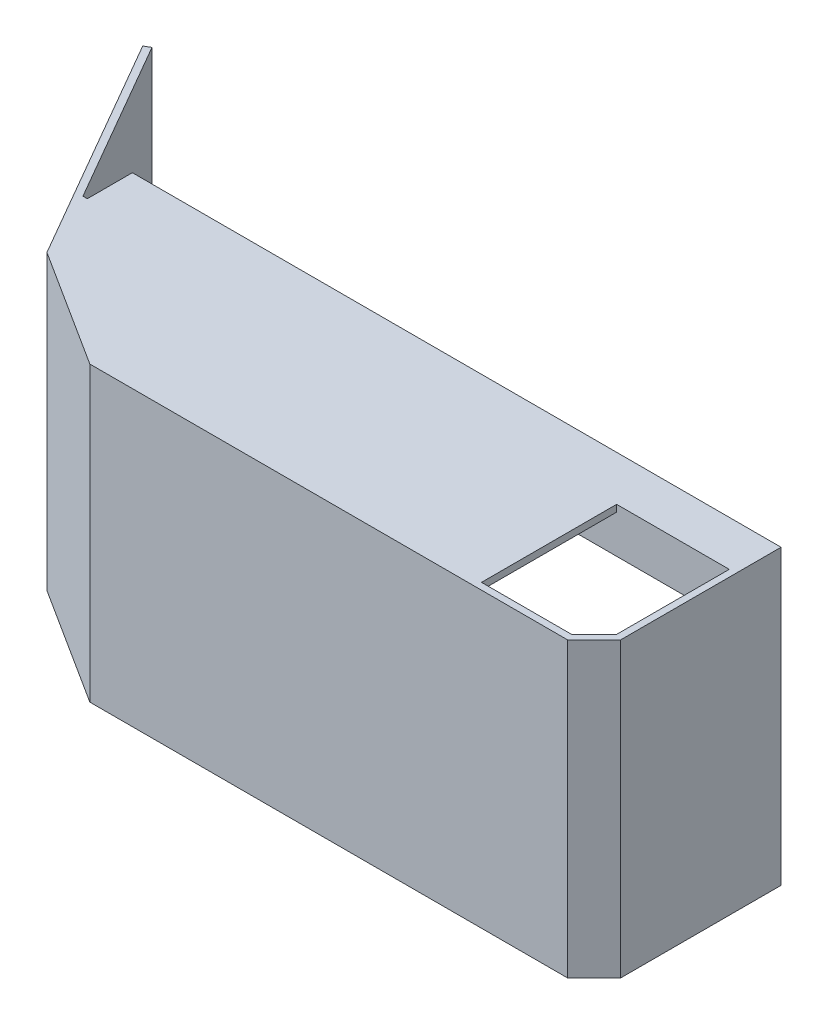
ISO-10303-21;
HEADER;
FILE_DESCRIPTION(('STEP AP214'),'2;1');
FILE_NAME('part.step','',(''),(''),'','','');
FILE_SCHEMA(('AUTOMOTIVE_DESIGN { 1 0 10303 214 1 1 1 1 }'));
ENDSEC;
DATA;
#1=APPLICATION_CONTEXT('core data for automotive mechanical design processes');
#2=APPLICATION_PROTOCOL_DEFINITION('international standard','automotive_design',2000,#1);
#3=PRODUCT_CONTEXT('',#1,'mechanical');
#4=PRODUCT('Part','Part','',(#3));
#5=PRODUCT_RELATED_PRODUCT_CATEGORY('part','',(#4));
#6=PRODUCT_DEFINITION_FORMATION('','',#4);
#7=PRODUCT_DEFINITION_CONTEXT('part definition',#1,'design');
#8=PRODUCT_DEFINITION('design','',#6,#7);
#9=PRODUCT_DEFINITION_SHAPE('','',#8);
#10=(LENGTH_UNIT() NAMED_UNIT(*) SI_UNIT(.MILLI.,.METRE.));
#11=(NAMED_UNIT(*) PLANE_ANGLE_UNIT() SI_UNIT($,.RADIAN.));
#12=(NAMED_UNIT(*) SI_UNIT($,.STERADIAN.) SOLID_ANGLE_UNIT());
#13=UNCERTAINTY_MEASURE_WITH_UNIT(LENGTH_MEASURE(1.E-05),#10,'distance_accuracy_value','');
#14=(GEOMETRIC_REPRESENTATION_CONTEXT(3) GLOBAL_UNCERTAINTY_ASSIGNED_CONTEXT((#13)) GLOBAL_UNIT_ASSIGNED_CONTEXT((#10,
#11,#12)) REPRESENTATION_CONTEXT('',''));
#15=CARTESIAN_POINT('',(0.,0.,0.));
#16=DIRECTION('',(0.,0.,1.));
#17=DIRECTION('',(1.,0.,0.));
#18=AXIS2_PLACEMENT_3D('',#15,#16,#17);
#19=CARTESIAN_POINT('',(0.,0.,20.));
#20=DIRECTION('',(0.,0.,-1.));
#21=DIRECTION('',(-1.,0.,0.));
#22=AXIS2_PLACEMENT_3D('',#19,#20,#21);
#23=PLANE('',#22);
#24=DIRECTION('',(0.,1.,0.));
#25=VECTOR('',#24,1.);
#26=CARTESIAN_POINT('',(122.5,-45.,20.));
#27=LINE('',#26,#25);
#28=CARTESIAN_POINT('',(122.5,-45.,20.));
#29=VERTEX_POINT('',#28);
#30=CARTESIAN_POINT('',(122.5,45.,20.));
#31=VERTEX_POINT('',#30);
#32=EDGE_CURVE('E394',#29,#31,#27,.T.);
#33=ORIENTED_EDGE('',*,*,#32,.F.);
#34=DIRECTION('',(1.,0.,0.));
#35=VECTOR('',#34,1.);
#36=CARTESIAN_POINT('',(-122.5,-45.,20.));
#37=LINE('',#36,#35);
#38=CARTESIAN_POINT('',(-122.5,-45.,20.));
#39=VERTEX_POINT('',#38);
#40=EDGE_CURVE('E405',#39,#29,#37,.T.);
#41=ORIENTED_EDGE('',*,*,#40,.F.);
#42=DIRECTION('',(0.,-1.,0.));
#43=VECTOR('',#42,1.);
#44=CARTESIAN_POINT('',(-122.5,-45.,20.));
#45=LINE('',#44,#43);
#46=CARTESIAN_POINT('',(-122.5,45.,20.));
#47=VERTEX_POINT('',#46);
#48=EDGE_CURVE('E401',#47,#39,#45,.T.);
#49=ORIENTED_EDGE('',*,*,#48,.F.);
#50=DIRECTION('',(-1.,0.,0.));
#51=VECTOR('',#50,1.);
#52=CARTESIAN_POINT('',(-122.5,45.,20.));
#53=LINE('',#52,#51);
#54=EDGE_CURVE('E397',#31,#47,#53,.T.);
#55=ORIENTED_EDGE('',*,*,#54,.F.);
#56=EDGE_LOOP('',(#33,#41,#49,#55));
#57=FACE_BOUND('',#56,.T.);
#58=DIRECTION('',(1.,0.,0.));
#59=VECTOR('',#58,1.);
#60=CARTESIAN_POINT('',(-188.916853121617,62.,20.));
#61=LINE('',#60,#59);
#62=CARTESIAN_POINT('',(-142.5,62.,20.));
#63=VERTEX_POINT('',#62);
#64=CARTESIAN_POINT('',(92.5,62.,20.));
#65=VERTEX_POINT('',#64);
#66=EDGE_CURVE('E519',#63,#65,#61,.T.);
#67=ORIENTED_EDGE('',*,*,#66,.F.);
#68=DIRECTION('',(0.,-1.,0.));
#69=VECTOR('',#68,1.);
#70=CARTESIAN_POINT('',(-142.5,-65.,20.));
#71=LINE('',#70,#69);
#72=CARTESIAN_POINT('',(-142.5,-62.,20.));
#73=VERTEX_POINT('',#72);
#74=EDGE_CURVE('E445',#63,#73,#71,.T.);
#75=ORIENTED_EDGE('',*,*,#74,.T.);
#76=DIRECTION('',(1.,0.,0.));
#77=VECTOR('',#76,1.);
#78=CARTESIAN_POINT('',(-188.916853121617,-62.,20.));
#79=LINE('',#78,#77);
#80=CARTESIAN_POINT('',(92.5,-62.,20.));
#81=VERTEX_POINT('',#80);
#82=EDGE_CURVE('E269',#73,#81,#79,.T.);
#83=ORIENTED_EDGE('',*,*,#82,.T.);
#84=DIRECTION('',(0.,-1.,0.));
#85=VECTOR('',#84,1.);
#86=CARTESIAN_POINT('',(92.5,-65.,20.));
#87=LINE('',#86,#85);
#88=CARTESIAN_POINT('',(92.5,-65.,20.));
#89=VERTEX_POINT('',#88);
#90=EDGE_CURVE('E248',#81,#89,#87,.T.);
#91=ORIENTED_EDGE('',*,*,#90,.T.);
#92=DIRECTION('',(1.,0.,0.));
#93=VECTOR('',#92,1.);
#94=CARTESIAN_POINT('',(-142.5,-65.,20.));
#95=LINE('',#94,#93);
#96=CARTESIAN_POINT('',(142.5,-65.,20.));
#97=VERTEX_POINT('',#96);
#98=EDGE_CURVE('E450',#89,#97,#95,.T.);
#99=ORIENTED_EDGE('',*,*,#98,.T.);
#100=DIRECTION('',(0.,1.,0.));
#101=VECTOR('',#100,1.);
#102=CARTESIAN_POINT('',(142.5,-65.,20.));
#103=LINE('',#102,#101);
#104=CARTESIAN_POINT('',(142.5,65.,20.));
#105=VERTEX_POINT('',#104);
#106=EDGE_CURVE('E437',#97,#105,#103,.T.);
#107=ORIENTED_EDGE('',*,*,#106,.T.);
#108=DIRECTION('',(-1.,0.,0.));
#109=VECTOR('',#108,1.);
#110=CARTESIAN_POINT('',(-142.5,65.,20.));
#111=LINE('',#110,#109);
#112=CARTESIAN_POINT('',(92.5,65.,20.));
#113=VERTEX_POINT('',#112);
#114=EDGE_CURVE('E441',#105,#113,#111,.T.);
#115=ORIENTED_EDGE('',*,*,#114,.T.);
#116=DIRECTION('',(0.,-1.,0.));
#117=VECTOR('',#116,1.);
#118=CARTESIAN_POINT('',(92.5,65.,20.));
#119=LINE('',#118,#117);
#120=EDGE_CURVE('E59',#113,#65,#119,.T.);
#121=ORIENTED_EDGE('',*,*,#120,.T.);
#122=EDGE_LOOP('',(#67,#75,#83,#91,#99,#107,#115,#121));
#123=FACE_BOUND('',#122,.T.);
#124=ADVANCED_FACE('F43',(#57,#123),#23,.F.);
#125=CARTESIAN_POINT('',(-186.316776910264,-65.,-52.5205715851498));
#126=DIRECTION('',(-0.866025403784439,0.,0.499999999999999));
#127=DIRECTION('',(0.499999999999999,0.,0.866025403784439));
#128=AXIS2_PLACEMENT_3D('',#125,#126,#127);
#129=PLANE('',#128);
#130=DIRECTION('',(0.499999999999999,0.,0.866025403784439));
#131=VECTOR('',#130,1.);
#132=CARTESIAN_POINT('',(-129.583705204715,62.,45.7439910783089));
#133=LINE('',#132,#131);
#134=CARTESIAN_POINT('',(-144.447005383792,62.,20.));
#135=VERTEX_POINT('',#134);
#136=CARTESIAN_POINT('',(-128.581749991301,62.,47.4794284148502));
#137=VERTEX_POINT('',#136);
#138=EDGE_CURVE('E527',#135,#137,#133,.T.);
#139=ORIENTED_EDGE('',*,*,#138,.T.);
#140=DIRECTION('',(0.,1.,0.));
#141=VECTOR('',#140,1.);
#142=CARTESIAN_POINT('',(-128.581749991301,-65.,47.4794284148502));
#143=LINE('',#142,#141);
#144=CARTESIAN_POINT('',(-128.581749991301,-62.,47.4794284148502));
#145=VERTEX_POINT('',#144);
#146=EDGE_CURVE('E377',#145,#137,#143,.T.);
#147=ORIENTED_EDGE('',*,*,#146,.F.);
#148=DIRECTION('',(-0.499999999999999,0.,-0.866025403784439));
#149=VECTOR('',#148,1.);
#150=CARTESIAN_POINT('',(-129.583705204715,-62.,45.7439910783089));
#151=LINE('',#150,#149);
#152=CARTESIAN_POINT('',(-144.447005383792,-62.,20.));
#153=VERTEX_POINT('',#152);
#154=EDGE_CURVE('E280',#145,#153,#151,.T.);
#155=ORIENTED_EDGE('',*,*,#154,.T.);
#156=DIRECTION('',(0.,-1.,0.));
#157=VECTOR('',#156,1.);
#158=CARTESIAN_POINT('',(-144.447005383792,-65.,20.));
#159=LINE('',#158,#157);
#160=CARTESIAN_POINT('',(-144.447005383792,-65.,20.));
#161=VERTEX_POINT('',#160);
#162=EDGE_CURVE('E235',#153,#161,#159,.T.);
#163=ORIENTED_EDGE('',*,*,#162,.T.);
#164=DIRECTION('',(0.499999999999999,0.,0.866025403784439));
#165=VECTOR('',#164,1.);
#166=CARTESIAN_POINT('',(-186.316776910264,-65.,-52.5205715851498));
#167=LINE('',#166,#165);
#168=CARTESIAN_POINT('',(-186.316776910264,-65.,-52.5205715851498));
#169=VERTEX_POINT('',#168);
#170=EDGE_CURVE('E304',#169,#161,#167,.T.);
#171=ORIENTED_EDGE('',*,*,#170,.F.);
#172=DIRECTION('',(0.,1.,0.));
#173=VECTOR('',#172,1.);
#174=CARTESIAN_POINT('',(-186.316776910264,-65.,-52.5205715851498));
#175=LINE('',#174,#173);
#176=CARTESIAN_POINT('',(-186.316776910264,65.,-52.5205715851498));
#177=VERTEX_POINT('',#176);
#178=EDGE_CURVE('E373',#169,#177,#175,.T.);
#179=ORIENTED_EDGE('',*,*,#178,.T.);
#180=DIRECTION('',(0.499999999999999,0.,0.866025403784439));
#181=VECTOR('',#180,1.);
#182=CARTESIAN_POINT('',(-186.316776910264,65.,-52.5205715851498));
#183=LINE('',#182,#181);
#184=CARTESIAN_POINT('',(-144.447005383792,65.,20.));
#185=VERTEX_POINT('',#184);
#186=EDGE_CURVE('E223',#177,#185,#183,.T.);
#187=ORIENTED_EDGE('',*,*,#186,.T.);
#188=DIRECTION('',(0.,-1.,0.));
#189=VECTOR('',#188,1.);
#190=CARTESIAN_POINT('',(-144.447005383792,65.,20.));
#191=LINE('',#190,#189);
#192=EDGE_CURVE('E67',#185,#135,#191,.T.);
#193=ORIENTED_EDGE('',*,*,#192,.T.);
#194=EDGE_LOOP('',(#139,#147,#155,#163,#171,#179,#187,#193));
#195=FACE_BOUND('',#194,.T.);
#196=ADVANCED_FACE('F499',(#195),#129,.F.);
#197=CARTESIAN_POINT('',(-128.581749991301,-65.,47.4794284148502));
#198=DIRECTION('',(-0.537040077774181,0.,0.84355672889516));
#199=DIRECTION('',(0.84355672889516,0.,0.537040077774181));
#200=AXIS2_PLACEMENT_3D('',#197,#198,#199);
#201=PLANE('',#200);
#202=DIRECTION('',(0.84355672889516,0.,0.537040077774181));
#203=VECTOR('',#202,1.);
#204=CARTESIAN_POINT('',(-156.782890650228,62.,29.5255170132701));
#205=LINE('',#204,#203);
#206=CARTESIAN_POINT('',(-77.5,62.,80.));
#207=VERTEX_POINT('',#206);
#208=EDGE_CURVE('E524',#137,#207,#205,.T.);
#209=ORIENTED_EDGE('',*,*,#208,.T.);
#210=DIRECTION('',(0.,1.,0.));
#211=VECTOR('',#210,1.);
#212=CARTESIAN_POINT('',(-77.5,-65.,80.));
#213=LINE('',#212,#211);
#214=CARTESIAN_POINT('',(-77.5,-62.,80.));
#215=VERTEX_POINT('',#214);
#216=EDGE_CURVE('E381',#215,#207,#213,.T.);
#217=ORIENTED_EDGE('',*,*,#216,.F.);
#218=DIRECTION('',(-0.84355672889516,0.,-0.537040077774181));
#219=VECTOR('',#218,1.);
#220=CARTESIAN_POINT('',(-156.782890650228,-62.,29.5255170132701));
#221=LINE('',#220,#219);
#222=EDGE_CURVE('E270',#215,#145,#221,.T.);
#223=ORIENTED_EDGE('',*,*,#222,.T.);
#224=ORIENTED_EDGE('',*,*,#146,.T.);
#225=EDGE_LOOP('',(#209,#217,#223,#224));
#226=FACE_BOUND('',#225,.T.);
#227=ADVANCED_FACE('F555',(#226),#201,.F.);
#228=CARTESIAN_POINT('',(-77.5,-65.,80.));
#229=DIRECTION('',(0.,0.,1.));
#230=DIRECTION('',(1.,0.,0.));
#231=AXIS2_PLACEMENT_3D('',#228,#229,#230);
#232=PLANE('',#231);
#233=DIRECTION('',(1.,0.,0.));
#234=VECTOR('',#233,1.);
#235=CARTESIAN_POINT('',(-188.916853121617,62.,80.));
#236=LINE('',#235,#234);
#237=CARTESIAN_POINT('',(92.5,62.,80.));
#238=VERTEX_POINT('',#237);
#239=EDGE_CURVE('E230',#207,#238,#236,.T.);
#240=ORIENTED_EDGE('',*,*,#239,.T.);
#241=DIRECTION('',(0.,1.,0.));
#242=VECTOR('',#241,1.);
#243=CARTESIAN_POINT('',(92.5,65.,80.));
#244=LINE('',#243,#242);
#245=CARTESIAN_POINT('',(92.5,65.,80.));
#246=VERTEX_POINT('',#245);
#247=EDGE_CURVE('E226',#238,#246,#244,.T.);
#248=ORIENTED_EDGE('',*,*,#247,.T.);
#249=DIRECTION('',(1.,0.,0.));
#250=VECTOR('',#249,1.);
#251=CARTESIAN_POINT('',(-77.5,65.,80.));
#252=LINE('',#251,#250);
#253=CARTESIAN_POINT('',(132.5,65.,80.));
#254=VERTEX_POINT('',#253);
#255=EDGE_CURVE('E212',#246,#254,#252,.T.);
#256=ORIENTED_EDGE('',*,*,#255,.T.);
#257=DIRECTION('',(0.,1.,0.));
#258=VECTOR('',#257,1.);
#259=CARTESIAN_POINT('',(132.5,-65.,80.));
#260=LINE('',#259,#258);
#261=CARTESIAN_POINT('',(132.5,-65.,80.));
#262=VERTEX_POINT('',#261);
#263=EDGE_CURVE('E384',#262,#254,#260,.T.);
#264=ORIENTED_EDGE('',*,*,#263,.F.);
#265=DIRECTION('',(1.,0.,0.));
#266=VECTOR('',#265,1.);
#267=CARTESIAN_POINT('',(-77.5,-65.,80.));
#268=LINE('',#267,#266);
#269=CARTESIAN_POINT('',(92.5,-65.,80.));
#270=VERTEX_POINT('',#269);
#271=EDGE_CURVE('E301',#270,#262,#268,.T.);
#272=ORIENTED_EDGE('',*,*,#271,.F.);
#273=DIRECTION('',(0.,1.,0.));
#274=VECTOR('',#273,1.);
#275=CARTESIAN_POINT('',(92.5,-65.,80.));
#276=LINE('',#275,#274);
#277=CARTESIAN_POINT('',(92.5,-62.,80.));
#278=VERTEX_POINT('',#277);
#279=EDGE_CURVE('E258',#270,#278,#276,.T.);
#280=ORIENTED_EDGE('',*,*,#279,.T.);
#281=DIRECTION('',(1.,0.,0.));
#282=VECTOR('',#281,1.);
#283=CARTESIAN_POINT('',(-188.916853121617,-62.,80.));
#284=LINE('',#283,#282);
#285=EDGE_CURVE('E265',#215,#278,#284,.T.);
#286=ORIENTED_EDGE('',*,*,#285,.F.);
#287=ORIENTED_EDGE('',*,*,#216,.T.);
#288=EDGE_LOOP('',(#240,#248,#256,#264,#272,#280,#286,#287));
#289=FACE_BOUND('',#288,.T.);
#290=ADVANCED_FACE('F227',(#289),#232,.F.);
#291=CARTESIAN_POINT('',(0.,0.,0.));
#292=DIRECTION('',(0.,0.,-1.));
#293=DIRECTION('',(-1.,0.,0.));
#294=AXIS2_PLACEMENT_3D('',#291,#292,#293);
#295=PLANE('',#294);
#296=DIRECTION('',(-1.,0.,0.));
#297=VECTOR('',#296,1.);
#298=CARTESIAN_POINT('',(-142.5,65.,0.));
#299=LINE('',#298,#297);
#300=CARTESIAN_POINT('',(145.5,65.,0.));
#301=VERTEX_POINT('',#300);
#302=CARTESIAN_POINT('',(-142.5,65.,0.));
#303=VERTEX_POINT('',#302);
#304=EDGE_CURVE('E436',#301,#303,#299,.T.);
#305=ORIENTED_EDGE('',*,*,#304,.F.);
#306=DIRECTION('',(0.,1.,0.));
#307=VECTOR('',#306,1.);
#308=CARTESIAN_POINT('',(145.5,-65.,0.));
#309=LINE('',#308,#307);
#310=CARTESIAN_POINT('',(145.5,-65.,0.));
#311=VERTEX_POINT('',#310);
#312=EDGE_CURVE('E327',#311,#301,#309,.T.);
#313=ORIENTED_EDGE('',*,*,#312,.F.);
#314=DIRECTION('',(1.,0.,0.));
#315=VECTOR('',#314,1.);
#316=CARTESIAN_POINT('',(-142.5,-65.,0.));
#317=LINE('',#316,#315);
#318=CARTESIAN_POINT('',(-142.5,-65.,0.));
#319=VERTEX_POINT('',#318);
#320=EDGE_CURVE('E442',#319,#311,#317,.T.);
#321=ORIENTED_EDGE('',*,*,#320,.F.);
#322=DIRECTION('',(0.,-1.,0.));
#323=VECTOR('',#322,1.);
#324=CARTESIAN_POINT('',(-142.5,-65.,0.));
#325=LINE('',#324,#323);
#326=EDGE_CURVE('E455',#303,#319,#325,.T.);
#327=ORIENTED_EDGE('',*,*,#326,.F.);
#328=EDGE_LOOP('',(#305,#313,#321,#327));
#329=FACE_BOUND('',#328,.T.);
#330=DIRECTION('',(1.,0.,0.));
#331=VECTOR('',#330,1.);
#332=CARTESIAN_POINT('',(-122.5,-45.,0.));
#333=LINE('',#332,#331);
#334=CARTESIAN_POINT('',(-122.5,-45.,0.));
#335=VERTEX_POINT('',#334);
#336=CARTESIAN_POINT('',(122.5,-45.,0.));
#337=VERTEX_POINT('',#336);
#338=EDGE_CURVE('E398',#335,#337,#333,.T.);
#339=ORIENTED_EDGE('',*,*,#338,.T.);
#340=DIRECTION('',(0.,1.,0.));
#341=VECTOR('',#340,1.);
#342=CARTESIAN_POINT('',(122.5,-45.,0.));
#343=LINE('',#342,#341);
#344=CARTESIAN_POINT('',(122.5,45.,0.));
#345=VERTEX_POINT('',#344);
#346=EDGE_CURVE('E360',#337,#345,#343,.T.);
#347=ORIENTED_EDGE('',*,*,#346,.T.);
#348=DIRECTION('',(-1.,0.,0.));
#349=VECTOR('',#348,1.);
#350=CARTESIAN_POINT('',(-122.5,45.,0.));
#351=LINE('',#350,#349);
#352=CARTESIAN_POINT('',(-122.5,45.,0.));
#353=VERTEX_POINT('',#352);
#354=EDGE_CURVE('E412',#345,#353,#351,.T.);
#355=ORIENTED_EDGE('',*,*,#354,.T.);
#356=DIRECTION('',(0.,-1.,0.));
#357=VECTOR('',#356,1.);
#358=CARTESIAN_POINT('',(-122.5,-45.,0.));
#359=LINE('',#358,#357);
#360=EDGE_CURVE('E416',#353,#335,#359,.T.);
#361=ORIENTED_EDGE('',*,*,#360,.T.);
#362=EDGE_LOOP('',(#339,#347,#355,#361));
#363=FACE_BOUND('',#362,.T.);
#364=ADVANCED_FACE('F471',(#329,#363),#295,.T.);
#365=CARTESIAN_POINT('',(-142.5,65.,20.));
#366=DIRECTION('',(0.,-1.,0.));
#367=DIRECTION('',(0.,0.,-1.));
#368=AXIS2_PLACEMENT_3D('',#365,#366,#367);
#369=PLANE('',#368);
#370=DIRECTION('',(0.,0.,-1.));
#371=VECTOR('',#370,1.);
#372=CARTESIAN_POINT('',(92.5,65.,80.));
#373=LINE('',#372,#371);
#374=EDGE_CURVE('E216',#246,#113,#373,.T.);
#375=ORIENTED_EDGE('',*,*,#374,.T.);
#376=ORIENTED_EDGE('',*,*,#114,.F.);
#377=DIRECTION('',(0.,0.,-1.));
#378=VECTOR('',#377,1.);
#379=CARTESIAN_POINT('',(142.5,65.,70.));
#380=LINE('',#379,#378);
#381=CARTESIAN_POINT('',(142.5,65.,70.));
#382=VERTEX_POINT('',#381);
#383=EDGE_CURVE('E331',#382,#105,#380,.T.);
#384=ORIENTED_EDGE('',*,*,#383,.F.);
#385=DIRECTION('',(0.707106781186548,0.,-0.707106781186547));
#386=VECTOR('',#385,1.);
#387=CARTESIAN_POINT('',(132.5,65.,80.));
#388=LINE('',#387,#386);
#389=EDGE_CURVE('E218',#254,#382,#388,.T.);
#390=ORIENTED_EDGE('',*,*,#389,.F.);
#391=ORIENTED_EDGE('',*,*,#255,.F.);
#392=EDGE_LOOP('',(#375,#376,#384,#390,#391));
#393=FACE_BOUND('',#392,.T.);
#394=ORIENTED_EDGE('',*,*,#304,.T.);
#395=DIRECTION('',(0.,0.,-1.));
#396=VECTOR('',#395,1.);
#397=CARTESIAN_POINT('',(-142.5,65.,20.));
#398=LINE('',#397,#396);
#399=CARTESIAN_POINT('',(-142.5,65.,20.));
#400=VERTEX_POINT('',#399);
#401=EDGE_CURVE('E11',#400,#303,#398,.T.);
#402=ORIENTED_EDGE('',*,*,#401,.F.);
#403=DIRECTION('',(1.,0.,0.));
#404=VECTOR('',#403,1.);
#405=CARTESIAN_POINT('',(-188.916853121617,65.,20.));
#406=LINE('',#405,#404);
#407=EDGE_CURVE('E520',#185,#400,#406,.T.);
#408=ORIENTED_EDGE('',*,*,#407,.F.);
#409=ORIENTED_EDGE('',*,*,#186,.F.);
#410=DIRECTION('',(0.866025403784441,0.,-0.499999999999997));
#411=VECTOR('',#410,1.);
#412=CARTESIAN_POINT('',(-188.914853121617,65.,-51.0205715851498));
#413=LINE('',#412,#411);
#414=CARTESIAN_POINT('',(-188.914853121617,65.,-51.0205715851498));
#415=VERTEX_POINT('',#414);
#416=EDGE_CURVE('E339',#415,#177,#413,.T.);
#417=ORIENTED_EDGE('',*,*,#416,.F.);
#418=DIRECTION('',(0.499999999999999,0.,0.866025403784439));
#419=VECTOR('',#418,1.);
#420=CARTESIAN_POINT('',(-188.914853121617,65.,-51.0205715851498));
#421=LINE('',#420,#419);
#422=CARTESIAN_POINT('',(-130.812533941448,65.,49.6155972724871));
#423=VERTEX_POINT('',#422);
#424=EDGE_CURVE('E342',#415,#423,#421,.T.);
#425=ORIENTED_EDGE('',*,*,#424,.T.);
#426=DIRECTION('',(0.84355672889516,0.,0.537040077774181));
#427=VECTOR('',#426,1.);
#428=CARTESIAN_POINT('',(-130.192870224624,65.,50.0100986015357));
#429=LINE('',#428,#427);
#430=CARTESIAN_POINT('',(-78.3739195317781,65.,83.));
#431=VERTEX_POINT('',#430);
#432=EDGE_CURVE('E346',#423,#431,#429,.T.);
#433=ORIENTED_EDGE('',*,*,#432,.T.);
#434=DIRECTION('',(1.,0.,0.));
#435=VECTOR('',#434,1.);
#436=CARTESIAN_POINT('',(-77.5,65.,83.));
#437=LINE('',#436,#435);
#438=CARTESIAN_POINT('',(133.742640687119,65.,83.));
#439=VERTEX_POINT('',#438);
#440=EDGE_CURVE('E350',#431,#439,#437,.T.);
#441=ORIENTED_EDGE('',*,*,#440,.T.);
#442=DIRECTION('',(0.707106781186548,0.,-0.707106781186547));
#443=VECTOR('',#442,1.);
#444=CARTESIAN_POINT('',(134.62132034356,65.,82.1213203435596));
#445=LINE('',#444,#443);
#446=CARTESIAN_POINT('',(145.5,65.,71.2426406871193));
#447=VERTEX_POINT('',#446);
#448=EDGE_CURVE('E294',#439,#447,#445,.T.);
#449=ORIENTED_EDGE('',*,*,#448,.T.);
#450=DIRECTION('',(0.,0.,-1.));
#451=VECTOR('',#450,1.);
#452=CARTESIAN_POINT('',(145.5,65.,70.));
#453=LINE('',#452,#451);
#454=EDGE_CURVE('E288',#447,#301,#453,.T.);
#455=ORIENTED_EDGE('',*,*,#454,.T.);
#456=EDGE_LOOP('',(#394,#402,#408,#409,#417,#425,#433,#441,#449,#455));
#457=FACE_BOUND('',#456,.T.);
#458=ADVANCED_FACE('F45',(#393,#457),#369,.F.);
#459=CARTESIAN_POINT('',(-142.5,-65.,20.));
#460=DIRECTION('',(1.,0.,0.));
#461=DIRECTION('',(0.,0.,-1.));
#462=AXIS2_PLACEMENT_3D('',#459,#460,#461);
#463=PLANE('',#462);
#464=ORIENTED_EDGE('',*,*,#326,.T.);
#465=DIRECTION('',(0.,0.,-1.));
#466=VECTOR('',#465,1.);
#467=CARTESIAN_POINT('',(-142.5,-65.,20.));
#468=LINE('',#467,#466);
#469=CARTESIAN_POINT('',(-142.5,-65.,20.));
#470=VERTEX_POINT('',#469);
#471=EDGE_CURVE('E52',#470,#319,#468,.T.);
#472=ORIENTED_EDGE('',*,*,#471,.F.);
#473=DIRECTION('',(0.,-1.,0.));
#474=VECTOR('',#473,1.);
#475=CARTESIAN_POINT('',(-142.5,-65.,20.));
#476=LINE('',#475,#474);
#477=EDGE_CURVE('E261',#73,#470,#476,.T.);
#478=ORIENTED_EDGE('',*,*,#477,.F.);
#479=ORIENTED_EDGE('',*,*,#74,.F.);
#480=EDGE_CURVE('E446',#400,#63,#71,.T.);
#481=ORIENTED_EDGE('',*,*,#480,.F.);
#482=ORIENTED_EDGE('',*,*,#401,.T.);
#483=EDGE_LOOP('',(#464,#472,#478,#479,#481,#482));
#484=FACE_BOUND('',#483,.T.);
#485=ADVANCED_FACE('F538',(#484),#463,.F.);
#486=CARTESIAN_POINT('',(-142.5,-65.,20.));
#487=DIRECTION('',(0.,1.,0.));
#488=DIRECTION('',(0.,0.,1.));
#489=AXIS2_PLACEMENT_3D('',#486,#487,#488);
#490=PLANE('',#489);
#491=ORIENTED_EDGE('',*,*,#98,.F.);
#492=DIRECTION('',(0.,0.,1.));
#493=VECTOR('',#492,1.);
#494=CARTESIAN_POINT('',(92.5,-65.,80.));
#495=LINE('',#494,#493);
#496=EDGE_CURVE('E253',#89,#270,#495,.T.);
#497=ORIENTED_EDGE('',*,*,#496,.T.);
#498=ORIENTED_EDGE('',*,*,#271,.T.);
#499=DIRECTION('',(0.707106781186548,0.,-0.707106781186547));
#500=VECTOR('',#499,1.);
#501=CARTESIAN_POINT('',(132.5,-65.,80.));
#502=LINE('',#501,#500);
#503=CARTESIAN_POINT('',(142.5,-65.,70.));
#504=VERTEX_POINT('',#503);
#505=EDGE_CURVE('E298',#262,#504,#502,.T.);
#506=ORIENTED_EDGE('',*,*,#505,.T.);
#507=DIRECTION('',(0.,0.,-1.));
#508=VECTOR('',#507,1.);
#509=CARTESIAN_POINT('',(142.5,-65.,70.));
#510=LINE('',#509,#508);
#511=EDGE_CURVE('E293',#504,#97,#510,.T.);
#512=ORIENTED_EDGE('',*,*,#511,.T.);
#513=EDGE_LOOP('',(#491,#497,#498,#506,#512));
#514=FACE_BOUND('',#513,.T.);
#515=ORIENTED_EDGE('',*,*,#320,.T.);
#516=DIRECTION('',(0.,0.,-1.));
#517=VECTOR('',#516,1.);
#518=CARTESIAN_POINT('',(145.5,-65.,70.));
#519=LINE('',#518,#517);
#520=CARTESIAN_POINT('',(145.5,-65.,71.2426406871193));
#521=VERTEX_POINT('',#520);
#522=EDGE_CURVE('E289',#521,#311,#519,.T.);
#523=ORIENTED_EDGE('',*,*,#522,.F.);
#524=DIRECTION('',(0.707106781186548,0.,-0.707106781186547));
#525=VECTOR('',#524,1.);
#526=CARTESIAN_POINT('',(134.62132034356,-65.,82.1213203435596));
#527=LINE('',#526,#525);
#528=CARTESIAN_POINT('',(133.742640687119,-65.,83.));
#529=VERTEX_POINT('',#528);
#530=EDGE_CURVE('E323',#529,#521,#527,.T.);
#531=ORIENTED_EDGE('',*,*,#530,.F.);
#532=DIRECTION('',(1.,0.,0.));
#533=VECTOR('',#532,1.);
#534=CARTESIAN_POINT('',(-77.5,-65.,83.));
#535=LINE('',#534,#533);
#536=CARTESIAN_POINT('',(-78.3739195317781,-65.,83.));
#537=VERTEX_POINT('',#536);
#538=EDGE_CURVE('E319',#537,#529,#535,.T.);
#539=ORIENTED_EDGE('',*,*,#538,.F.);
#540=DIRECTION('',(0.84355672889516,0.,0.537040077774181));
#541=VECTOR('',#540,1.);
#542=CARTESIAN_POINT('',(-130.192870224624,-65.,50.0100986015357));
#543=LINE('',#542,#541);
#544=CARTESIAN_POINT('',(-130.812533941448,-65.,49.6155972724871));
#545=VERTEX_POINT('',#544);
#546=EDGE_CURVE('E315',#545,#537,#543,.T.);
#547=ORIENTED_EDGE('',*,*,#546,.F.);
#548=DIRECTION('',(0.499999999999999,0.,0.866025403784439));
#549=VECTOR('',#548,1.);
#550=CARTESIAN_POINT('',(-188.914853121617,-65.,-51.0205715851498));
#551=LINE('',#550,#549);
#552=CARTESIAN_POINT('',(-188.914853121617,-65.,-51.0205715851498));
#553=VERTEX_POINT('',#552);
#554=EDGE_CURVE('E311',#553,#545,#551,.T.);
#555=ORIENTED_EDGE('',*,*,#554,.F.);
#556=DIRECTION('',(0.866025403784441,0.,-0.499999999999997));
#557=VECTOR('',#556,1.);
#558=CARTESIAN_POINT('',(-188.914853121617,-65.,-51.0205715851498));
#559=LINE('',#558,#557);
#560=EDGE_CURVE('E308',#553,#169,#559,.T.);
#561=ORIENTED_EDGE('',*,*,#560,.T.);
#562=ORIENTED_EDGE('',*,*,#170,.T.);
#563=DIRECTION('',(1.,0.,0.));
#564=VECTOR('',#563,1.);
#565=CARTESIAN_POINT('',(-188.916853121617,-65.,20.));
#566=LINE('',#565,#564);
#567=EDGE_CURVE('E257',#161,#470,#566,.T.);
#568=ORIENTED_EDGE('',*,*,#567,.T.);
#569=ORIENTED_EDGE('',*,*,#471,.T.);
#570=EDGE_LOOP('',(#515,#523,#531,#539,#547,#555,#561,#562,#568,#569));
#571=FACE_BOUND('',#570,.T.);
#572=ADVANCED_FACE('F463',(#514,#571),#490,.F.);
#573=CARTESIAN_POINT('',(122.5,-45.,20.));
#574=DIRECTION('',(-1.,0.,0.));
#575=DIRECTION('',(0.,0.,1.));
#576=AXIS2_PLACEMENT_3D('',#573,#574,#575);
#577=PLANE('',#576);
#578=ORIENTED_EDGE('',*,*,#346,.F.);
#579=DIRECTION('',(0.,0.,-1.));
#580=VECTOR('',#579,1.);
#581=CARTESIAN_POINT('',(122.5,-45.,20.));
#582=LINE('',#581,#580);
#583=EDGE_CURVE('E408',#29,#337,#582,.T.);
#584=ORIENTED_EDGE('',*,*,#583,.F.);
#585=ORIENTED_EDGE('',*,*,#32,.T.);
#586=DIRECTION('',(0.,0.,-1.));
#587=VECTOR('',#586,1.);
#588=CARTESIAN_POINT('',(122.5,45.,20.));
#589=LINE('',#588,#587);
#590=EDGE_CURVE('E432',#31,#345,#589,.T.);
#591=ORIENTED_EDGE('',*,*,#590,.T.);
#592=EDGE_LOOP('',(#578,#584,#585,#591));
#593=FACE_BOUND('',#592,.T.);
#594=ADVANCED_FACE('F559',(#593),#577,.T.);
#595=CARTESIAN_POINT('',(-122.5,45.,20.));
#596=DIRECTION('',(0.,-1.,0.));
#597=DIRECTION('',(0.,0.,-1.));
#598=AXIS2_PLACEMENT_3D('',#595,#596,#597);
#599=PLANE('',#598);
#600=ORIENTED_EDGE('',*,*,#354,.F.);
#601=ORIENTED_EDGE('',*,*,#590,.F.);
#602=ORIENTED_EDGE('',*,*,#54,.T.);
#603=DIRECTION('',(0.,0.,-1.));
#604=VECTOR('',#603,1.);
#605=CARTESIAN_POINT('',(-122.5,45.,20.));
#606=LINE('',#605,#604);
#607=EDGE_CURVE('E429',#47,#353,#606,.T.);
#608=ORIENTED_EDGE('',*,*,#607,.T.);
#609=EDGE_LOOP('',(#600,#601,#602,#608));
#610=FACE_BOUND('',#609,.T.);
#611=ADVANCED_FACE('F567',(#610),#599,.T.);
#612=CARTESIAN_POINT('',(-122.5,-45.,20.));
#613=DIRECTION('',(1.,0.,0.));
#614=DIRECTION('',(0.,0.,-1.));
#615=AXIS2_PLACEMENT_3D('',#612,#613,#614);
#616=PLANE('',#615);
#617=ORIENTED_EDGE('',*,*,#360,.F.);
#618=ORIENTED_EDGE('',*,*,#607,.F.);
#619=ORIENTED_EDGE('',*,*,#48,.T.);
#620=DIRECTION('',(0.,0.,-1.));
#621=VECTOR('',#620,1.);
#622=CARTESIAN_POINT('',(-122.5,-45.,20.));
#623=LINE('',#622,#621);
#624=EDGE_CURVE('E426',#39,#335,#623,.T.);
#625=ORIENTED_EDGE('',*,*,#624,.T.);
#626=EDGE_LOOP('',(#617,#618,#619,#625));
#627=FACE_BOUND('',#626,.T.);
#628=ADVANCED_FACE('F598',(#627),#616,.T.);
#629=CARTESIAN_POINT('',(-122.5,-45.,20.));
#630=DIRECTION('',(0.,1.,0.));
#631=DIRECTION('',(0.,0.,1.));
#632=AXIS2_PLACEMENT_3D('',#629,#630,#631);
#633=PLANE('',#632);
#634=ORIENTED_EDGE('',*,*,#338,.F.);
#635=ORIENTED_EDGE('',*,*,#624,.F.);
#636=ORIENTED_EDGE('',*,*,#40,.T.);
#637=ORIENTED_EDGE('',*,*,#583,.T.);
#638=EDGE_LOOP('',(#634,#635,#636,#637));
#639=FACE_BOUND('',#638,.T.);
#640=ADVANCED_FACE('F592',(#639),#633,.T.);
#641=CARTESIAN_POINT('',(142.5,-65.,70.));
#642=DIRECTION('',(1.,0.,0.));
#643=DIRECTION('',(0.,0.,-1.));
#644=AXIS2_PLACEMENT_3D('',#641,#642,#643);
#645=PLANE('',#644);
#646=ORIENTED_EDGE('',*,*,#383,.T.);
#647=ORIENTED_EDGE('',*,*,#106,.F.);
#648=ORIENTED_EDGE('',*,*,#511,.F.);
#649=DIRECTION('',(0.,1.,0.));
#650=VECTOR('',#649,1.);
#651=CARTESIAN_POINT('',(142.5,-65.,70.));
#652=LINE('',#651,#650);
#653=EDGE_CURVE('E387',#504,#382,#652,.T.);
#654=ORIENTED_EDGE('',*,*,#653,.T.);
#655=EDGE_LOOP('',(#646,#647,#648,#654));
#656=FACE_BOUND('',#655,.T.);
#657=ADVANCED_FACE('F590',(#656),#645,.F.);
#658=CARTESIAN_POINT('',(145.5,-65.,70.));
#659=DIRECTION('',(1.,0.,0.));
#660=DIRECTION('',(0.,0.,-1.));
#661=AXIS2_PLACEMENT_3D('',#658,#659,#660);
#662=PLANE('',#661);
#663=ORIENTED_EDGE('',*,*,#454,.F.);
#664=DIRECTION('',(0.,1.,0.));
#665=VECTOR('',#664,1.);
#666=CARTESIAN_POINT('',(145.5,-65.,71.2426406871193));
#667=LINE('',#666,#665);
#668=EDGE_CURVE('E357',#521,#447,#667,.T.);
#669=ORIENTED_EDGE('',*,*,#668,.F.);
#670=ORIENTED_EDGE('',*,*,#522,.T.);
#671=ORIENTED_EDGE('',*,*,#312,.T.);
#672=EDGE_LOOP('',(#663,#669,#670,#671));
#673=FACE_BOUND('',#672,.T.);
#674=ADVANCED_FACE('F475',(#673),#662,.T.);
#675=CARTESIAN_POINT('',(134.62132034356,-65.,82.1213203435596));
#676=DIRECTION('',(0.707106781186547,0.,0.707106781186548));
#677=DIRECTION('',(0.707106781186548,0.,-0.707106781186547));
#678=AXIS2_PLACEMENT_3D('',#675,#676,#677);
#679=PLANE('',#678);
#680=ORIENTED_EDGE('',*,*,#448,.F.);
#681=DIRECTION('',(0.,1.,0.));
#682=VECTOR('',#681,1.);
#683=CARTESIAN_POINT('',(133.742640687119,-65.,83.));
#684=LINE('',#683,#682);
#685=EDGE_CURVE('E361',#529,#439,#684,.T.);
#686=ORIENTED_EDGE('',*,*,#685,.F.);
#687=ORIENTED_EDGE('',*,*,#530,.T.);
#688=ORIENTED_EDGE('',*,*,#668,.T.);
#689=EDGE_LOOP('',(#680,#686,#687,#688));
#690=FACE_BOUND('',#689,.T.);
#691=ADVANCED_FACE('F480',(#690),#679,.T.);
#692=CARTESIAN_POINT('',(-77.5,-65.,83.));
#693=DIRECTION('',(0.,0.,1.));
#694=DIRECTION('',(1.,0.,0.));
#695=AXIS2_PLACEMENT_3D('',#692,#693,#694);
#696=PLANE('',#695);
#697=ORIENTED_EDGE('',*,*,#440,.F.);
#698=DIRECTION('',(0.,1.,0.));
#699=VECTOR('',#698,1.);
#700=CARTESIAN_POINT('',(-78.3739195317781,-65.,83.));
#701=LINE('',#700,#699);
#702=EDGE_CURVE('E364',#537,#431,#701,.T.);
#703=ORIENTED_EDGE('',*,*,#702,.F.);
#704=ORIENTED_EDGE('',*,*,#538,.T.);
#705=ORIENTED_EDGE('',*,*,#685,.T.);
#706=EDGE_LOOP('',(#697,#703,#704,#705));
#707=FACE_BOUND('',#706,.T.);
#708=ADVANCED_FACE('F483',(#707),#696,.T.);
#709=CARTESIAN_POINT('',(-130.192870224624,-65.,50.0100986015357));
#710=DIRECTION('',(-0.537040077774181,0.,0.84355672889516));
#711=DIRECTION('',(0.84355672889516,0.,0.537040077774181));
#712=AXIS2_PLACEMENT_3D('',#709,#710,#711);
#713=PLANE('',#712);
#714=ORIENTED_EDGE('',*,*,#432,.F.);
#715=DIRECTION('',(0.,1.,0.));
#716=VECTOR('',#715,1.);
#717=CARTESIAN_POINT('',(-130.812533941448,-65.,49.6155972724871));
#718=LINE('',#717,#716);
#719=EDGE_CURVE('E367',#545,#423,#718,.T.);
#720=ORIENTED_EDGE('',*,*,#719,.F.);
#721=ORIENTED_EDGE('',*,*,#546,.T.);
#722=ORIENTED_EDGE('',*,*,#702,.T.);
#723=EDGE_LOOP('',(#714,#720,#721,#722));
#724=FACE_BOUND('',#723,.T.);
#725=ADVANCED_FACE('F488',(#724),#713,.T.);
#726=CARTESIAN_POINT('',(-188.914853121617,-65.,-51.0205715851498));
#727=DIRECTION('',(-0.866025403784439,0.,0.499999999999999));
#728=DIRECTION('',(0.499999999999999,0.,0.866025403784439));
#729=AXIS2_PLACEMENT_3D('',#726,#727,#728);
#730=PLANE('',#729);
#731=ORIENTED_EDGE('',*,*,#424,.F.);
#732=DIRECTION('',(0.,1.,0.));
#733=VECTOR('',#732,1.);
#734=CARTESIAN_POINT('',(-188.914853121617,-65.,-51.0205715851498));
#735=LINE('',#734,#733);
#736=EDGE_CURVE('E370',#553,#415,#735,.T.);
#737=ORIENTED_EDGE('',*,*,#736,.F.);
#738=ORIENTED_EDGE('',*,*,#554,.T.);
#739=ORIENTED_EDGE('',*,*,#719,.T.);
#740=EDGE_LOOP('',(#731,#737,#738,#739));
#741=FACE_BOUND('',#740,.T.);
#742=ADVANCED_FACE('F491',(#741),#730,.T.);
#743=CARTESIAN_POINT('',(-188.914853121617,-65.,-51.0205715851498));
#744=DIRECTION('',(0.499999999999997,0.,0.86602540378444));
#745=DIRECTION('',(0.86602540378444,0.,-0.499999999999997));
#746=AXIS2_PLACEMENT_3D('',#743,#744,#745);
#747=PLANE('',#746);
#748=ORIENTED_EDGE('',*,*,#416,.T.);
#749=ORIENTED_EDGE('',*,*,#178,.F.);
#750=ORIENTED_EDGE('',*,*,#560,.F.);
#751=ORIENTED_EDGE('',*,*,#736,.T.);
#752=EDGE_LOOP('',(#748,#749,#750,#751));
#753=FACE_BOUND('',#752,.T.);
#754=ADVANCED_FACE('F496',(#753),#747,.F.);
#755=CARTESIAN_POINT('',(132.5,-65.,80.));
#756=DIRECTION('',(0.707106781186547,0.,0.707106781186548));
#757=DIRECTION('',(0.707106781186548,0.,-0.707106781186547));
#758=AXIS2_PLACEMENT_3D('',#755,#756,#757);
#759=PLANE('',#758);
#760=ORIENTED_EDGE('',*,*,#389,.T.);
#761=ORIENTED_EDGE('',*,*,#653,.F.);
#762=ORIENTED_EDGE('',*,*,#505,.F.);
#763=ORIENTED_EDGE('',*,*,#263,.T.);
#764=EDGE_LOOP('',(#760,#761,#762,#763));
#765=FACE_BOUND('',#764,.T.);
#766=ADVANCED_FACE('F586',(#765),#759,.F.);
#767=CARTESIAN_POINT('',(-188.916853121617,-65.,20.));
#768=DIRECTION('',(0.,0.,1.));
#769=DIRECTION('',(0.,-1.,0.));
#770=AXIS2_PLACEMENT_3D('',#767,#768,#769);
#771=PLANE('',#770);
#772=EDGE_CURVE('E271',#153,#73,#79,.T.);
#773=ORIENTED_EDGE('',*,*,#772,.T.);
#774=ORIENTED_EDGE('',*,*,#477,.T.);
#775=ORIENTED_EDGE('',*,*,#567,.F.);
#776=ORIENTED_EDGE('',*,*,#162,.F.);
#777=EDGE_LOOP('',(#773,#774,#775,#776));
#778=FACE_BOUND('',#777,.T.);
#779=ADVANCED_FACE('F505',(#778),#771,.F.);
#780=CARTESIAN_POINT('',(-188.916853121617,-62.,80.));
#781=DIRECTION('',(0.,-1.,0.));
#782=DIRECTION('',(0.,0.,-1.));
#783=AXIS2_PLACEMENT_3D('',#780,#781,#782);
#784=PLANE('',#783);
#785=ORIENTED_EDGE('',*,*,#222,.F.);
#786=ORIENTED_EDGE('',*,*,#285,.T.);
#787=DIRECTION('',(0.,0.,-1.));
#788=VECTOR('',#787,1.);
#789=CARTESIAN_POINT('',(92.5,-62.,80.));
#790=LINE('',#789,#788);
#791=EDGE_CURVE('E252',#278,#81,#790,.T.);
#792=ORIENTED_EDGE('',*,*,#791,.T.);
#793=ORIENTED_EDGE('',*,*,#82,.F.);
#794=ORIENTED_EDGE('',*,*,#772,.F.);
#795=ORIENTED_EDGE('',*,*,#154,.F.);
#796=EDGE_LOOP('',(#785,#786,#792,#793,#794,#795));
#797=FACE_BOUND('',#796,.T.);
#798=ADVANCED_FACE('F509',(#797),#784,.F.);
#799=CARTESIAN_POINT('',(92.5,0.,0.));
#800=DIRECTION('',(-1.,0.,0.));
#801=DIRECTION('',(0.,0.,1.));
#802=AXIS2_PLACEMENT_3D('',#799,#800,#801);
#803=PLANE('',#802);
#804=ORIENTED_EDGE('',*,*,#279,.F.);
#805=ORIENTED_EDGE('',*,*,#496,.F.);
#806=ORIENTED_EDGE('',*,*,#90,.F.);
#807=ORIENTED_EDGE('',*,*,#791,.F.);
#808=EDGE_LOOP('',(#804,#805,#806,#807));
#809=FACE_BOUND('',#808,.T.);
#810=ADVANCED_FACE('F574',(#809),#803,.F.);
#811=CARTESIAN_POINT('',(-188.916853121617,65.,20.));
#812=DIRECTION('',(0.,0.,1.));
#813=DIRECTION('',(1.,0.,0.));
#814=AXIS2_PLACEMENT_3D('',#811,#812,#813);
#815=PLANE('',#814);
#816=ORIENTED_EDGE('',*,*,#407,.T.);
#817=ORIENTED_EDGE('',*,*,#480,.T.);
#818=EDGE_CURVE('E244',#135,#63,#61,.T.);
#819=ORIENTED_EDGE('',*,*,#818,.F.);
#820=ORIENTED_EDGE('',*,*,#192,.F.);
#821=EDGE_LOOP('',(#816,#817,#819,#820));
#822=FACE_BOUND('',#821,.T.);
#823=ADVANCED_FACE('F536',(#822),#815,.F.);
#824=CARTESIAN_POINT('',(-188.916853121617,62.,80.));
#825=DIRECTION('',(0.,1.,0.));
#826=DIRECTION('',(0.,0.,1.));
#827=AXIS2_PLACEMENT_3D('',#824,#825,#826);
#828=PLANE('',#827);
#829=ORIENTED_EDGE('',*,*,#138,.F.);
#830=ORIENTED_EDGE('',*,*,#818,.T.);
#831=ORIENTED_EDGE('',*,*,#66,.T.);
#832=DIRECTION('',(0.,0.,1.));
#833=VECTOR('',#832,1.);
#834=CARTESIAN_POINT('',(92.5,62.,80.));
#835=LINE('',#834,#833);
#836=EDGE_CURVE('E236',#65,#238,#835,.T.);
#837=ORIENTED_EDGE('',*,*,#836,.T.);
#838=ORIENTED_EDGE('',*,*,#239,.F.);
#839=ORIENTED_EDGE('',*,*,#208,.F.);
#840=EDGE_LOOP('',(#829,#830,#831,#837,#838,#839));
#841=FACE_BOUND('',#840,.T.);
#842=ADVANCED_FACE('F532',(#841),#828,.F.);
#843=CARTESIAN_POINT('',(92.5,0.,0.));
#844=DIRECTION('',(1.,0.,0.));
#845=DIRECTION('',(0.,0.,-1.));
#846=AXIS2_PLACEMENT_3D('',#843,#844,#845);
#847=PLANE('',#846);
#848=ORIENTED_EDGE('',*,*,#247,.F.);
#849=ORIENTED_EDGE('',*,*,#836,.F.);
#850=ORIENTED_EDGE('',*,*,#120,.F.);
#851=ORIENTED_EDGE('',*,*,#374,.F.);
#852=EDGE_LOOP('',(#848,#849,#850,#851));
#853=FACE_BOUND('',#852,.T.);
#854=ADVANCED_FACE('F238',(#853),#847,.T.);
#855=CLOSED_SHELL('',(#124,#196,#227,#290,#364,#458,#485,#572,#594,#611,#628,#640,#657,#674,
#691,#708,#725,#742,#754,#766,#779,#798,#810,#823,#842,#854));
#856=MANIFOLD_SOLID_BREP('B2',#855);
#857=ADVANCED_BREP_SHAPE_REPRESENTATION('',(#18,#856),#14);
#858=SHAPE_DEFINITION_REPRESENTATION(#9,#857);
ENDSEC;
END-ISO-10303-21;
